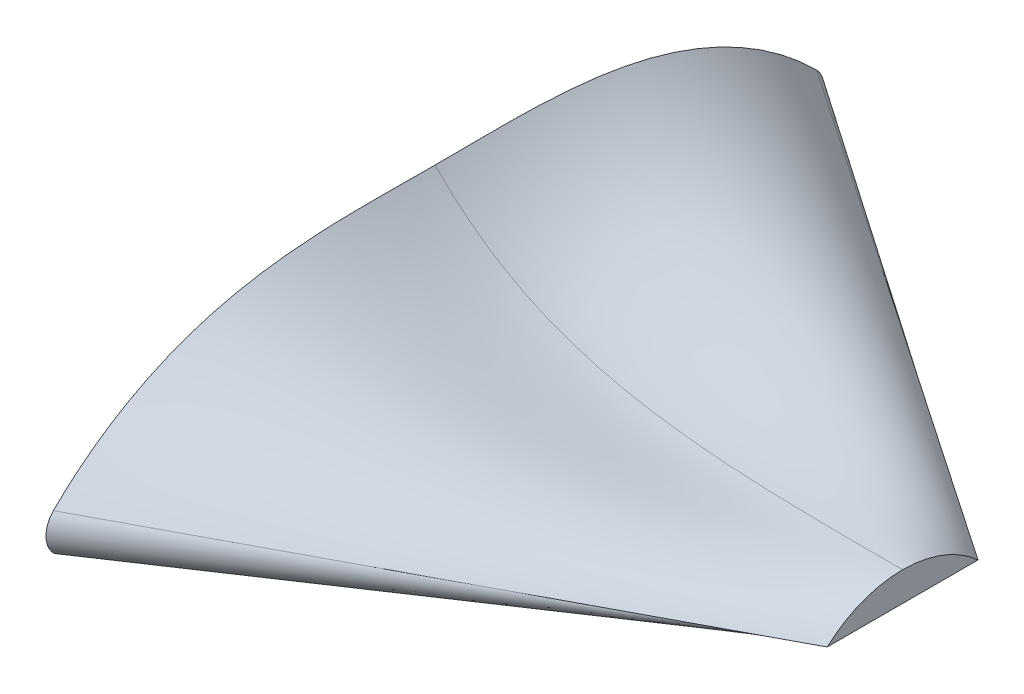
ISO-10303-21;
HEADER;
FILE_DESCRIPTION(('STEP AP214'),'2;1');
FILE_NAME('part.step','',(''),(''),'','','');
FILE_SCHEMA(('AUTOMOTIVE_DESIGN { 1 0 10303 214 1 1 1 1 }'));
ENDSEC;
DATA;
#1=APPLICATION_CONTEXT('core data for automotive mechanical design processes');
#2=APPLICATION_PROTOCOL_DEFINITION('international standard','automotive_design',2000,#1);
#3=PRODUCT_CONTEXT('',#1,'mechanical');
#4=PRODUCT('Part','Part','',(#3));
#5=PRODUCT_RELATED_PRODUCT_CATEGORY('part','',(#4));
#6=PRODUCT_DEFINITION_FORMATION('','',#4);
#7=PRODUCT_DEFINITION_CONTEXT('part definition',#1,'design');
#8=PRODUCT_DEFINITION('design','',#6,#7);
#9=PRODUCT_DEFINITION_SHAPE('','',#8);
#10=(LENGTH_UNIT() NAMED_UNIT(*) SI_UNIT(.MILLI.,.METRE.));
#11=(NAMED_UNIT(*) PLANE_ANGLE_UNIT() SI_UNIT($,.RADIAN.));
#12=(NAMED_UNIT(*) SI_UNIT($,.STERADIAN.) SOLID_ANGLE_UNIT());
#13=UNCERTAINTY_MEASURE_WITH_UNIT(LENGTH_MEASURE(1.E-05),#10,'distance_accuracy_value','');
#14=(GEOMETRIC_REPRESENTATION_CONTEXT(3) GLOBAL_UNCERTAINTY_ASSIGNED_CONTEXT((#13)) GLOBAL_UNIT_ASSIGNED_CONTEXT((#10,
#11,#12)) REPRESENTATION_CONTEXT('',''));
#15=CARTESIAN_POINT('',(0.,0.,0.));
#16=DIRECTION('',(0.,0.,1.));
#17=DIRECTION('',(1.,0.,0.));
#18=AXIS2_PLACEMENT_3D('',#15,#16,#17);
#19=CARTESIAN_POINT('',(5.,0.,0.));
#20=DIRECTION('',(-1.,0.,0.));
#21=DIRECTION('',(0.,0.,1.));
#22=AXIS2_PLACEMENT_3D('',#19,#20,#21);
#23=PLANE('',#22);
#24=CARTESIAN_POINT('',(5.,4.99999999999999,-39.9999631911383));
#25=DIRECTION('',(-1.,0.,0.));
#26=DIRECTION('',(0.,0.,1.));
#27=AXIS2_PLACEMENT_3D('',#24,#25,#26);
#28=CIRCLE('',#27,4.00000000000001);
#29=CARTESIAN_POINT('',(5.,4.99999999999999,-35.9999631911383));
#30=VERTEX_POINT('',#29);
#31=EDGE_CURVE('E304',#30,#30,#28,.T.);
#32=ORIENTED_EDGE('',*,*,#31,.F.);
#33=EDGE_LOOP('',(#32));
#34=FACE_BOUND('',#33,.T.);
#35=CARTESIAN_POINT('',(5.,3.59999999999999,-76.7254190205042));
#36=CARTESIAN_POINT('',(5.,3.93743228357616,-76.3874018561561));
#37=CARTESIAN_POINT('',(5.,4.26765023761743,-76.0421847193579));
#38=CARTESIAN_POINT('',(5.,4.91305336804679,-75.3380492013204));
#39=CARTESIAN_POINT('',(5.,5.22824034681512,-74.9791324721533));
#40=CARTESIAN_POINT('',(5.,5.84303741353757,-74.2482403196132));
#41=CARTESIAN_POINT('',(5.,6.14264858405348,-73.8762658068108));
#42=CARTESIAN_POINT('',(5.,6.7257829860108,-73.1199272854748));
#43=CARTESIAN_POINT('',(5.,7.00930660717979,-72.7355635774285));
#44=CARTESIAN_POINT('',(5.,7.55501458514436,-71.9619058359314));
#45=CARTESIAN_POINT('',(5.,7.81748343604167,-71.5728124190995));
#46=CARTESIAN_POINT('',(5.,8.32599247402661,-70.7840431241096));
#47=CARTESIAN_POINT('',(5.,8.57203291478204,-70.384367409484));
#48=CARTESIAN_POINT('',(5.,9.0473155388448,-69.575165888886));
#49=CARTESIAN_POINT('',(5.,9.27655818285029,-69.1656403534653));
#50=CARTESIAN_POINT('',(5.,9.7179358459217,-68.3375077942191));
#51=CARTESIAN_POINT('',(5.,9.93007196262451,-67.9189013552585));
#52=CARTESIAN_POINT('',(5.,10.3373422104496,-67.0728350064427));
#53=CARTESIAN_POINT('',(5.,10.5324540206845,-66.6453643565745));
#54=CARTESIAN_POINT('',(5.,10.9052984125998,-65.7829008197929));
#55=CARTESIAN_POINT('',(5.,11.0830305296047,-65.3479077321202));
#56=CARTESIAN_POINT('',(5.,11.4211557563464,-64.4712051567223));
#57=CARTESIAN_POINT('',(5.,11.5815476779937,-64.0294952111435));
#58=CARTESIAN_POINT('',(5.,11.8851368938041,-63.1402056710114));
#59=CARTESIAN_POINT('',(5.,12.0283339677281,-62.6926260013574));
#60=CARTESIAN_POINT('',(5.,12.2990221749549,-61.7883957563251));
#61=CARTESIAN_POINT('',(5.,12.4263617772562,-61.331699878374));
#62=CARTESIAN_POINT('',(5.,12.6642653606371,-60.4139905299096));
#63=CARTESIAN_POINT('',(5.,12.7748300989486,-59.9529772552854));
#64=CARTESIAN_POINT('',(5.,12.979772806041,-59.027431837586));
#65=CARTESIAN_POINT('',(5.,13.0741526428364,-58.5629001070715));
#66=CARTESIAN_POINT('',(5.,13.2475078904096,-57.6311638525804));
#67=CARTESIAN_POINT('',(5.,13.3264890258607,-57.1639603886011));
#68=CARTESIAN_POINT('',(5.,13.4834911977533,-56.1395599554604));
#69=CARTESIAN_POINT('',(5.,13.5585569415281,-55.5819104072356));
#70=CARTESIAN_POINT('',(5.,13.6902095100587,-54.4644382967973));
#71=CARTESIAN_POINT('',(5.,13.7467955399675,-53.9046156421621));
#72=CARTESIAN_POINT('',(5.,13.8436291600977,-52.7832396184939));
#73=CARTESIAN_POINT('',(5.,13.8838668706888,-52.2216854089481));
#74=CARTESIAN_POINT('',(5.,13.9503294054591,-51.0973089222936));
#75=CARTESIAN_POINT('',(5.,13.9765427549874,-50.5344859840233));
#76=CARTESIAN_POINT('',(5.,14.017455103225,-49.4080448908364));
#77=CARTESIAN_POINT('',(5.,14.0321460205014,-48.8444264550463));
#78=CARTESIAN_POINT('',(5.,14.052549816619,-47.7275563872463));
#79=CARTESIAN_POINT('',(5.,14.0584250202647,-47.1743074462124));
#80=CARTESIAN_POINT('',(5.,14.0643881773846,-46.0679660488893));
#81=CARTESIAN_POINT('',(5.,14.0644779979006,-45.514873599719));
#82=CARTESIAN_POINT('',(5.,14.0615319358146,-44.4092862800449));
#83=CARTESIAN_POINT('',(5.,14.0584993546539,-43.856791395417));
#84=CARTESIAN_POINT('',(5.,14.0518660343467,-42.7528399211496));
#85=CARTESIAN_POINT('',(5.,14.048266369452,-42.2013833240343));
#86=CARTESIAN_POINT('',(5.,14.0441755921167,-41.3749374732235));
#87=CARTESIAN_POINT('',(5.,14.0430307910705,-41.0999519509151));
#88=CARTESIAN_POINT('',(5.,14.0414238818554,-40.549977837875));
#89=CARTESIAN_POINT('',(5.00000000000001,14.0409617766091,-40.2749892471352));
#90=CARTESIAN_POINT('',(5.00000000000003,14.0409660441617,-40.));
#91=B_SPLINE_CURVE_WITH_KNOTS('',3,(#35,#36,#37,#38,#39,#40,#41,#42,#43,#44,#45,#46,#47,#48,#49,
#50,#51,#52,#53,#54,#55,#56,#57,#58,#59,#60,#61,#62,#63,#64,#65,#66,#67,#68,#69,#70,#71,#72,#73,
#74,#75,#76,#77,#78,#79,#80,#81,#82,#83,#84,#85,#86,#87,#88,#89,#90),.UNSPECIFIED.,.F.,.F.,(4,2,
2,2,2,2,2,2,2,2,2,2,2,2,2,2,2,2,2,2,2,2,2,2,2,2,2,4),(0.,1.43273489925903,2.86529756353206,
4.29776052725402,5.73018877413619,7.13781356403322,8.54541661404931,9.95298104453301,
11.3604550869443,12.769747602725,14.179077788027,15.5885044745873,16.9979492117726,
18.4199693092654,19.8419251964366,21.2637168549556,22.6849789312863,24.3726622680029,
26.0604181855732,27.749192537579,29.4393465300067,31.130684880218,32.7904809299915,
34.449741332609,36.1072491321412,37.761653983198,38.586616898807,39.411583345995),.UNSPECIFIED.);
#92=CARTESIAN_POINT('',(5.,3.59999999999999,-76.7254190205042));
#93=VERTEX_POINT('',#92);
#94=CARTESIAN_POINT('',(4.99999999856672,14.0409660471408,-40.));
#95=VERTEX_POINT('',#94);
#96=EDGE_CURVE('E190',#93,#95,#91,.T.);
#97=ORIENTED_EDGE('',*,*,#96,.F.);
#98=CARTESIAN_POINT('',(5.,0.,-76.659471836822));
#99=CARTESIAN_POINT('',(5.,0.0511488168467018,-76.7118126949849));
#100=CARTESIAN_POINT('',(5.,0.10452466581077,-76.7619709941109));
#101=CARTESIAN_POINT('',(5.,0.215314804936702,-76.8576199049824));
#102=CARTESIAN_POINT('',(5.,0.272729423525625,-76.9031101363859));
#103=CARTESIAN_POINT('',(5.,0.391146477501311,-76.9890924523508));
#104=CARTESIAN_POINT('',(5.,0.452147293723972,-77.0295867673589));
#105=CARTESIAN_POINT('',(5.,0.577341762314448,-77.1052971840566));
#106=CARTESIAN_POINT('',(5.,0.641535361954586,-77.1405133728741));
#107=CARTESIAN_POINT('',(5.,0.772666053999531,-77.2053169724821));
#108=CARTESIAN_POINT('',(5.,0.839601750755324,-77.2349072045036));
#109=CARTESIAN_POINT('',(5.,0.97575401334259,-77.2882236835449));
#110=CARTESIAN_POINT('',(5.,1.04497016593395,-77.3119509864309));
#111=CARTESIAN_POINT('',(5.,1.185115336312,-77.3534309711804));
#112=CARTESIAN_POINT('',(5.,1.25604309645116,-77.3711879047799));
#113=CARTESIAN_POINT('',(5.,1.39921583880213,-77.4006343950045));
#114=CARTESIAN_POINT('',(5.,1.47146200068962,-77.4123182111698));
#115=CARTESIAN_POINT('',(5.,1.61581215271314,-77.4293634913821));
#116=CARTESIAN_POINT('',(5.,1.68790713297469,-77.4348003165059));
#117=CARTESIAN_POINT('',(5.,1.83230335185098,-77.4394669144797));
#118=CARTESIAN_POINT('',(5.,1.90460466685098,-77.4386939730176));
#119=CARTESIAN_POINT('',(5.,2.12099597497724,-77.4271026830581));
#120=CARTESIAN_POINT('',(5.,2.26474244761141,-77.4070316597572));
#121=CARTESIAN_POINT('',(5.,2.4753066605448,-77.359115334133));
#122=CARTESIAN_POINT('',(5.,2.5443356053733,-77.3403059657367));
#123=CARTESIAN_POINT('',(5.,2.68048132502429,-77.2968954955494));
#124=CARTESIAN_POINT('',(5.,2.74759985544425,-77.2722999172473));
#125=CARTESIAN_POINT('',(5.,2.94535098790418,-77.1899719720296));
#126=CARTESIAN_POINT('',(5.,3.07255353093709,-77.1236588626164));
#127=CARTESIAN_POINT('',(5.,3.26633227779034,-77.0007179054517));
#128=CARTESIAN_POINT('',(5.,3.33710273869416,-76.9505101938476));
#129=CARTESIAN_POINT('',(5.,3.47295335784409,-76.84310361131));
#130=CARTESIAN_POINT('',(5.,3.53804165900599,-76.7859150361764));
#131=CARTESIAN_POINT('',(5.,3.59999999999999,-76.7254190205042));
#132=B_SPLINE_CURVE_WITH_KNOTS('',3,(#98,#99,#100,#101,#102,#103,#104,#105,#106,#107,#108,#109,
#110,#111,#112,#113,#114,#115,#116,#117,#118,#119,#120,#121,#122,#123,#124,#125,#126,#127,#128,
#129,#130,#131),.UNSPECIFIED.,.F.,.F.,(4,2,2,2,2,2,2,2,2,2,2,2,2,2,2,2,4),(0.,0.219477114664113,
0.438972097576259,0.658368728712478,0.877761737794023,1.09704443667954,1.31628761568893,
1.53537433062462,1.7546677568382,1.97128698737865,2.18800090814341,2.62092424760503,
2.8353554661266,3.04958281430292,3.47750799326977,3.73741546458134,3.99694413791897),.UNSPECIFIED.);
#133=CARTESIAN_POINT('',(5.,0.,-76.659471836822));
#134=VERTEX_POINT('',#133);
#135=EDGE_CURVE('E197',#134,#93,#132,.T.);
#136=ORIENTED_EDGE('',*,*,#135,.F.);
#137=DIRECTION('',(0.,0.,-1.));
#138=VECTOR('',#137,1.);
#139=CARTESIAN_POINT('',(5.,0.,0.));
#140=LINE('',#139,#138);
#141=CARTESIAN_POINT('',(5.,0.,-3.34045454545455));
#142=VERTEX_POINT('',#141);
#143=EDGE_CURVE('E279',#142,#134,#140,.T.);
#144=ORIENTED_EDGE('',*,*,#143,.F.);
#145=CARTESIAN_POINT('',(5.,3.6,-3.2745));
#146=CARTESIAN_POINT('',(5.,3.51749186203193,-3.1939012074687));
#147=CARTESIAN_POINT('',(5.,3.42928684829486,-3.11911367760644));
#148=CARTESIAN_POINT('',(5.,3.24341173908781,-2.9823289359893));
#149=CARTESIAN_POINT('',(5.,3.14573855731913,-2.92033591555066));
#150=CARTESIAN_POINT('',(5.,2.98252051916328,-2.83183808090266));
#151=CARTESIAN_POINT('',(5.,2.91932653754998,-2.80092926685083));
#152=CARTESIAN_POINT('',(5.,2.79054927996777,-2.74457067225097));
#153=CARTESIAN_POINT('',(5.,2.72496581345368,-2.71912132817809));
#154=CARTESIAN_POINT('',(5.,2.5253418491453,-2.6512001910213));
#155=CARTESIAN_POINT('',(5.,2.38834860088624,-2.61711250048871));
#156=CARTESIAN_POINT('',(5.,2.1100167076104,-2.57180403676965));
#157=CARTESIAN_POINT('',(5.,1.96865979692565,-2.56069816595792));
#158=CARTESIAN_POINT('',(5.,1.68599629544457,-2.56232668360057));
#159=CARTESIAN_POINT('',(5.,1.5446897038734,-2.57506068753158));
#160=CARTESIAN_POINT('',(5.,1.33508993046166,-2.61147414129443));
#161=CARTESIAN_POINT('',(5.,1.26520169558626,-2.62664263348465));
#162=CARTESIAN_POINT('',(5.,1.12690542280786,-2.662722845137));
#163=CARTESIAN_POINT('',(5.,1.05849734316841,-2.68363440243172));
#164=CARTESIAN_POINT('',(5.,0.923657181644717,-2.73109941523135));
#165=CARTESIAN_POINT('',(5.,0.857225314519525,-2.75765348138443));
#166=CARTESIAN_POINT('',(5.,0.726848735943094,-2.81623905497365));
#167=CARTESIAN_POINT('',(5.,0.662903878534444,-2.8482702403719));
#168=CARTESIAN_POINT('',(5.,0.489924831171504,-2.94407802836477));
#169=CARTESIAN_POINT('',(5.,0.383864468657998,-3.01337967707288));
#170=CARTESIAN_POINT('',(5.,0.23324220274403,-3.12815484096427));
#171=CARTESIAN_POINT('',(5.,0.184443511471317,-3.16821971400462));
#172=CARTESIAN_POINT('',(5.,0.0898862280673335,-3.25179465643971));
#173=CARTESIAN_POINT('',(5.,0.0441278272990227,-3.29530494231967));
#174=CARTESIAN_POINT('',(5.,0.,-3.34045454545454));
#175=B_SPLINE_CURVE_WITH_KNOTS('',3,(#145,#146,#147,#148,#149,#150,#151,#152,#153,#154,#155,
#156,#157,#158,#159,#160,#161,#162,#163,#164,#165,#166,#167,#168,#169,#170,#171,#172,#173,#174),
.UNSPECIFIED.,.F.,.F.,(4,2,2,2,2,2,2,2,2,2,2,2,2,2,4),(0.,0.345797022912793,0.69170714529531,
0.902517605346588,1.11334491305228,1.53473295791806,1.95822277893635,2.38170576936788,
2.59605383287214,2.81039584443476,3.02476106451672,3.23911368490883,3.6176288967695,
3.80690900639607,3.99620101848904),.UNSPECIFIED.);
#176=CARTESIAN_POINT('',(5.,3.6,-3.2745));
#177=VERTEX_POINT('',#176);
#178=EDGE_CURVE('E160',#177,#142,#175,.T.);
#179=ORIENTED_EDGE('',*,*,#178,.F.);
#180=CARTESIAN_POINT('',(4.99999999856672,14.0409660471408,-40.));
#181=CARTESIAN_POINT('',(4.99999999948511,14.0409441539015,-39.5758257928182));
#182=CARTESIAN_POINT('',(4.99999999986199,14.0420593836273,-39.1516551944734));
#183=CARTESIAN_POINT('',(5.00000000013811,14.0455829547407,-38.3030214777094));
#184=CARTESIAN_POINT('',(5.00000000003701,14.0479922021839,-37.8785583627024));
#185=CARTESIAN_POINT('',(4.99999999996297,14.0531212087982,-37.029426145117));
#186=CARTESIAN_POINT('',(4.99999999999008,14.0558411199163,-36.6047570437742));
#187=CARTESIAN_POINT('',(5.00000000000993,14.0604782807002,-35.755296130507));
#188=CARTESIAN_POINT('',(5.00000000000266,14.0623953080717,-35.3305043171412));
#189=CARTESIAN_POINT('',(4.99999999999734,14.0642596077262,-34.4808815271381));
#190=CARTESIAN_POINT('',(4.99999999999928,14.0642067266955,-34.056050550026));
#191=CARTESIAN_POINT('',(5.00000000000073,14.0608994378944,-33.1989375948005));
#192=CARTESIAN_POINT('',(5.0000000000002,14.0575888263589,-32.7666557782155));
#193=CARTESIAN_POINT('',(4.9999999999998,14.0464082703539,-31.9022260994095));
#194=CARTESIAN_POINT('',(4.99999999999995,14.0385391645738,-31.4700782271743));
#195=CARTESIAN_POINT('',(5.00000000000005,14.0169784825218,-30.6060059129998));
#196=CARTESIAN_POINT('',(5.00000000000001,14.0032880322319,-30.1740814440167));
#197=CARTESIAN_POINT('',(4.99999999999999,13.9688684465812,-29.3105433150413));
#198=CARTESIAN_POINT('',(5.,13.9481399200274,-28.8789296314005));
#199=CARTESIAN_POINT('',(5.,13.8985045821,-28.0161022452724));
#200=CARTESIAN_POINT('',(5.,13.8695965222287,-27.5848886139364));
#201=CARTESIAN_POINT('',(5.,13.7937219468961,-26.6101297731266));
#202=CARTESIAN_POINT('',(5.,13.7440074795407,-26.0667931965869));
#203=CARTESIAN_POINT('',(5.,13.6278152939436,-24.9818039962027));
#204=CARTESIAN_POINT('',(5.,13.5613347266627,-24.4401516744132));
#205=CARTESIAN_POINT('',(5.,13.409845123432,-23.3594525199217));
#206=CARTESIAN_POINT('',(5.,13.3248370623947,-22.8204055516516));
#207=CARTESIAN_POINT('',(5.,13.1347600759931,-21.7458097085166));
#208=CARTESIAN_POINT('',(5.,13.0296900552281,-21.2102610263133));
#209=CARTESIAN_POINT('',(5.,12.799409222632,-20.1492347711758));
#210=CARTESIAN_POINT('',(5.,12.6744156108137,-19.623710224059));
#211=CARTESIAN_POINT('',(5.,12.4026239950708,-18.5782456156235));
#212=CARTESIAN_POINT('',(5.,12.2558233168376,-18.0583062476408));
#213=CARTESIAN_POINT('',(5.,11.9398048616604,-17.0252988560667));
#214=CARTESIAN_POINT('',(5.,11.7705880358376,-16.5122305419515));
#215=CARTESIAN_POINT('',(5.,11.4093378086784,-15.4941728659362));
#216=CARTESIAN_POINT('',(5.,11.2173044821212,-14.989183477564));
#217=CARTESIAN_POINT('',(5.,10.8460713043083,-14.0765713661721));
#218=CARTESIAN_POINT('',(5.,10.6705554623278,-13.6674462619844));
#219=CARTESIAN_POINT('',(5.,10.303913668885,-12.8561855396402));
#220=CARTESIAN_POINT('',(5.,10.1127859126404,-12.4540507361181));
#221=CARTESIAN_POINT('',(5.,9.71502542780087,-11.6575038847497));
#222=CARTESIAN_POINT('',(5.,9.50839211967086,-11.263092126255));
#223=CARTESIAN_POINT('',(5.,9.07980994627717,-10.4826720012449));
#224=CARTESIAN_POINT('',(5.,8.85786092307269,-10.0966637214429));
#225=CARTESIAN_POINT('',(5.,8.39892595577074,-9.33368693090498));
#226=CARTESIAN_POINT('',(5.,8.1619398653725,-8.95671850817015));
#227=CARTESIAN_POINT('',(5.,7.66681183255086,-8.20262556393348));
#228=CARTESIAN_POINT('',(5.,7.40827682217232,-7.82575902203173));
#229=CARTESIAN_POINT('',(5.,6.87609606969416,-7.0828263144194));
#230=CARTESIAN_POINT('',(5.,6.60244967462634,-6.71676061646734));
#231=CARTESIAN_POINT('',(5.,6.04045642267068,-5.99601734069202));
#232=CARTESIAN_POINT('',(5.,5.75210769555495,-5.64134122109332));
#233=CARTESIAN_POINT('',(5.,5.16114317106239,-4.94394712378118));
#234=CARTESIAN_POINT('',(5.,4.85852425825254,-4.6012317860012));
#235=CARTESIAN_POINT('',(5.,4.23947695732176,-3.92830884864478));
#236=CARTESIAN_POINT('',(4.99999999999998,3.92304423479402,-3.5981052365122));
#237=CARTESIAN_POINT('',(4.99999999999996,3.60000000000001,-3.27449999999997));
#238=B_SPLINE_CURVE_WITH_KNOTS('',3,(#180,#181,#182,#183,#184,#185,#186,#187,#188,#189,#190,
#191,#192,#193,#194,#195,#196,#197,#198,#199,#200,#201,#202,#203,#204,#205,#206,#207,#208,#209,
#210,#211,#212,#213,#214,#215,#216,#217,#218,#219,#220,#221,#222,#223,#224,#225,#226,#227,#228,
#229,#230,#231,#232,#233,#234,#235,#236,#237),.UNSPECIFIED.,.F.,.F.,(4,2,2,2,2,2,2,2,2,2,2,2,2,
2,2,2,2,2,2,2,2,2,2,2,2,2,2,2,4),(0.,1.27251617283478,2.54592450997283,3.81995836539354,
5.09434472962129,6.36883027666969,7.66569629239758,8.96232378143317,10.2587005868843,
11.5549652818272,12.8514279412633,14.4880113948628,16.1248731383354,17.7616487712977,
19.3985137992198,21.0186216671867,22.6389283812679,24.2591663674388,25.8793990435633,
27.2146401669907,28.5500358671852,29.8854815039684,31.2209409143752,32.5564133199181,
33.9270994781211,35.2978449105675,36.6687651474862,38.0399860787829,39.4116403995615),.UNSPECIFIED.);
#239=EDGE_CURVE('E13',#95,#177,#238,.T.);
#240=ORIENTED_EDGE('',*,*,#239,.F.);
#241=EDGE_LOOP('',(#97,#136,#144,#179,#240));
#242=FACE_BOUND('',#241,.T.);
#243=ADVANCED_FACE('F141',(#34,#242),#23,.T.);
#244=CARTESIAN_POINT('',(0.,3.99999999999999,-80.));
#245=CARTESIAN_POINT('',(16.6666666666667,2.66666666666666,-69.0847300683473));
#246=CARTESIAN_POINT('',(33.3333333333333,1.33333333333333,-58.1694601366945));
#247=CARTESIAN_POINT('',(50.,0.,-47.2541902050417));
#248=CARTESIAN_POINT('',(0.,6.63904405261519,-77.3609559473848));
#249=CARTESIAN_POINT('',(16.6666666666667,4.57394141092913,-67.1632839463743));
#250=CARTESIAN_POINT('',(33.3333333333333,2.50883876924307,-56.9656119453637));
#251=CARTESIAN_POINT('',(50.,0.443736127557011,-46.7679399443531));
#252=CARTESIAN_POINT('',(0.,11.3720944633804,-71.5812116978277));
#253=CARTESIAN_POINT('',(15.950170355026,6.51788597364558,-62.9574696470849));
#254=CARTESIAN_POINT('',(32.629103556807,3.88093649349558,-54.3337275963421));
#255=CARTESIAN_POINT('',(50.,1.245103807066,-45.7099855455994));
#256=CARTESIAN_POINT('',(0.,16.6162347407487,-61.7420127961851));
#257=CARTESIAN_POINT('',(13.8006814201041,5.87642750944805,-55.8014690698099));
#258=CARTESIAN_POINT('',(30.5164142272278,4.00565631648663,-49.8609253434348));
#259=CARTESIAN_POINT('',(50.,2.13935229840692,-43.9203816170601));
#260=CARTESIAN_POINT('',(0.,19.8401866065488,-51.0920119199332));
#261=CARTESIAN_POINT('',(11.6511924851822,3.7734502946322,-48.058931934915));
#262=CARTESIAN_POINT('',(28.4037248976486,3.22752704980928,-45.0258519498969));
#263=CARTESIAN_POINT('',(50.,2.68942136102937,-41.9927719648795));
#264=CARTESIAN_POINT('',(0.,20.5685424949238,-43.7023061077576));
#265=CARTESIAN_POINT('',(10.9346961735416,2.8215150380922,-42.6893373185495));
#266=CARTESIAN_POINT('',(27.6994951211223,2.81257236123952,-41.6763685293058));
#267=CARTESIAN_POINT('',(50.,2.8125767374507,-40.6633997403421));
#268=CARTESIAN_POINT('',(0.,20.5685424949238,-40.));
#269=CARTESIAN_POINT('',(10.9346961735416,2.82153606086535,-40.));
#270=CARTESIAN_POINT('',(27.6994951211223,2.81260170348539,-40.));
#271=CARTESIAN_POINT('',(50.,2.81260169586887,-40.0000000000008));
#272=B_SPLINE_SURFACE_WITH_KNOTS('',3,3,((#244,#245,#246,#247),(#248,#249,#250,#251),(#252,#253,
#254,#255),(#256,#257,#258,#259),(#260,#261,#262,#263),(#264,#265,#266,#267),(#268,#269,#270,
#271)),.UNSPECIFIED.,.F.,.F.,.F.,(4,1,1,1,4),(4,4),(0.744223091094177,0.808167318320632,
0.872111545547088,0.936055772773544,1.),(0.,1.),.UNSPECIFIED.);
#273=CARTESIAN_POINT('',(0.,3.99999999999999,-80.));
#274=CARTESIAN_POINT('',(16.6666666666667,2.66666666666666,-69.0847300683473));
#275=CARTESIAN_POINT('',(33.3333333333333,1.33333333333333,-58.1694601366945));
#276=CARTESIAN_POINT('',(50.,0.,-47.2541902050417));
#277=B_SPLINE_CURVE_WITH_KNOTS('',3,(#273,#274,#275,#276),.UNSPECIFIED.,.F.,.F.,(4,4),(0.,1.),.UNSPECIFIED.);
#278=CARTESIAN_POINT('',(50.,0.,-47.2541902050417));
#279=VERTEX_POINT('',#278);
#280=EDGE_CURVE('E146',#93,#279,#277,.T.);
#281=CARTESIAN_POINT('',(0.,20.5685424949238,-40.));
#282=CARTESIAN_POINT('',(10.9346961735416,2.82153606086535,-40.));
#283=CARTESIAN_POINT('',(27.6994951211223,2.81260170348539,-40.));
#284=CARTESIAN_POINT('',(50.,2.81260169586887,-40.0000000000008));
#285=B_SPLINE_CURVE_WITH_KNOTS('',3,(#281,#282,#283,#284),.UNSPECIFIED.,.F.,.F.,(4,4),(0.,1.),.UNSPECIFIED.);
#286=CARTESIAN_POINT('',(50.,2.81260169586887,-40.0000000000008));
#287=VERTEX_POINT('',#286);
#288=EDGE_CURVE('E167',#95,#287,#285,.T.);
#289=CARTESIAN_POINT('',(50.,-7.94965417671036,-39.9995951025209));
#290=DIRECTION('',(1.,0.,0.));
#291=DIRECTION('',(0.,0.,-1.));
#292=AXIS2_PLACEMENT_3D('',#289,#290,#291);
#293=CIRCLE('',#292,10.7622558801957);
#294=EDGE_CURVE('E205',#279,#287,#293,.T.);
#295=ORIENTED_EDGE('',*,*,#280,.F.);
#296=ORIENTED_EDGE('',*,*,#96,.T.);
#297=ORIENTED_EDGE('',*,*,#288,.T.);
#298=ORIENTED_EDGE('',*,*,#294,.F.);
#299=EDGE_LOOP('',(#295,#296,#297,#298));
#300=FACE_BOUND('',#299,.T.);
#301=ADVANCED_FACE('F195',(#300),#272,.T.);
#302=CARTESIAN_POINT('',(0.,0.,-80.));
#303=CARTESIAN_POINT('',(16.6666666666667,0.,-68.8649061227399));
#304=CARTESIAN_POINT('',(33.3333333333333,0.,-57.7298122454798));
#305=CARTESIAN_POINT('',(50.,0.,-46.5947183682197));
#306=CARTESIAN_POINT('',(0.,0.261799386095722,-80.2617993860957));
#307=CARTESIAN_POINT('',(16.6666666666667,0.174532924063815,-69.0577577089377));
#308=CARTESIAN_POINT('',(33.3333333333333,0.0872664620319073,-57.8537160317796));
#309=CARTESIAN_POINT('',(50.,0.,-46.6496743546216));
#310=CARTESIAN_POINT('',(0.,0.889345576944907,-80.681300868557));
#311=CARTESIAN_POINT('',(16.6666666666667,0.592897051296605,-69.3740626881798));
#312=CARTESIAN_POINT('',(33.3333333333334,0.296448525648302,-58.0668245078025));
#313=CARTESIAN_POINT('',(50.0000000000001,0.,-46.7595863274253));
#314=CARTESIAN_POINT('',(0.,2.,-80.9021203978851));
#315=CARTESIAN_POINT('',(16.6666666666667,1.33333333333334,-69.5762316941336));
#316=CARTESIAN_POINT('',(33.3333333333333,0.666666666666668,-58.2503429903822));
#317=CARTESIAN_POINT('',(50.,0.,-46.9244542866307));
#318=CARTESIAN_POINT('',(0.,3.1106544230551,-80.6813008685571));
#319=CARTESIAN_POINT('',(16.6666666666667,2.07376961537007,-69.4839746609834));
#320=CARTESIAN_POINT('',(33.3333333333334,1.03688480768503,-58.2866484534099));
#321=CARTESIAN_POINT('',(50.0000000000001,0.,-47.0893222458363));
#322=CARTESIAN_POINT('',(0.,3.73820061390428,-80.2617993860957));
#323=CARTESIAN_POINT('',(16.6666666666667,2.49213374260285,-69.2409443302771));
#324=CARTESIAN_POINT('',(33.3333333333333,1.24606687130143,-58.2200892744585));
#325=CARTESIAN_POINT('',(50.,0.,-47.1992342186399));
#326=CARTESIAN_POINT('',(0.,3.99999999999999,-80.));
#327=CARTESIAN_POINT('',(16.6666666666667,2.66666666666666,-69.0847300683473));
#328=CARTESIAN_POINT('',(33.3333333333333,1.33333333333333,-58.1694601366945));
#329=CARTESIAN_POINT('',(50.,0.,-47.2541902050417));
#330=B_SPLINE_SURFACE_WITH_KNOTS('',3,3,((#302,#303,#304,#305),(#306,#307,#308,#309),(#310,#311,
#312,#313),(#314,#315,#316,#317),(#318,#319,#320,#321),(#322,#323,#324,#325),(#326,#327,#328,
#329)),.UNSPECIFIED.,.F.,.F.,.F.,(4,1,1,1,4),(4,4),(0.72088961147396,0.726722981379014,
0.732556351284068,0.738389721189122,0.744223091094177),(0.,1.),.UNSPECIFIED.);
#331=CARTESIAN_POINT('',(0.,0.,-80.));
#332=CARTESIAN_POINT('',(16.6666666666667,0.,-68.8649061227399));
#333=CARTESIAN_POINT('',(33.3333333333333,0.,-57.7298122454798));
#334=CARTESIAN_POINT('',(50.,0.,-46.5947183682197));
#335=B_SPLINE_CURVE_WITH_KNOTS('',3,(#331,#332,#333,#334),.UNSPECIFIED.,.F.,.F.,(4,4),(0.,1.),.UNSPECIFIED.);
#336=CARTESIAN_POINT('',(50.,0.,-46.5947183682197));
#337=VERTEX_POINT('',#336);
#338=EDGE_CURVE('E207',#134,#337,#335,.T.);
#339=DIRECTION('',(0.,0.,-1.));
#340=VECTOR('',#339,1.);
#341=CARTESIAN_POINT('',(50.,0.,-32.745));
#342=LINE('',#341,#340);
#343=EDGE_CURVE('E241',#337,#279,#342,.T.);
#344=ORIENTED_EDGE('',*,*,#338,.F.);
#345=ORIENTED_EDGE('',*,*,#135,.T.);
#346=ORIENTED_EDGE('',*,*,#280,.T.);
#347=ORIENTED_EDGE('',*,*,#343,.F.);
#348=EDGE_LOOP('',(#344,#345,#346,#347));
#349=FACE_BOUND('',#348,.T.);
#350=ADVANCED_FACE('F248',(#349),#330,.T.);
#351=CARTESIAN_POINT('',(0.,0.,0.));
#352=DIRECTION('',(0.,-1.,0.));
#353=DIRECTION('',(0.,0.,-1.));
#354=AXIS2_PLACEMENT_3D('',#351,#352,#353);
#355=PLANE('',#354);
#356=CARTESIAN_POINT('',(0.,0.,0.));
#357=CARTESIAN_POINT('',(16.6666666666667,0.,-11.1348484848485));
#358=CARTESIAN_POINT('',(33.3333333333333,0.,-22.269696969697));
#359=CARTESIAN_POINT('',(50.,0.,-33.4045454545455));
#360=B_SPLINE_CURVE_WITH_KNOTS('',3,(#356,#357,#358,#359),.UNSPECIFIED.,.F.,.F.,(4,4),(0.,1.),.UNSPECIFIED.);
#361=CARTESIAN_POINT('',(50.,0.,-33.4045454545455));
#362=VERTEX_POINT('',#361);
#363=EDGE_CURVE('E387',#142,#362,#360,.T.);
#364=ORIENTED_EDGE('',*,*,#363,.F.);
#365=ORIENTED_EDGE('',*,*,#143,.T.);
#366=ORIENTED_EDGE('',*,*,#338,.T.);
#367=EDGE_CURVE('E381',#362,#337,#342,.T.);
#368=ORIENTED_EDGE('',*,*,#367,.F.);
#369=EDGE_LOOP('',(#364,#365,#366,#368));
#370=FACE_BOUND('',#369,.T.);
#371=ADVANCED_FACE('F143',(#370),#355,.T.);
#372=CARTESIAN_POINT('',(0.,4.,0.));
#373=CARTESIAN_POINT('',(16.6666666666667,2.66666666666667,-10.915));
#374=CARTESIAN_POINT('',(33.3333333333333,1.33333333333333,-21.83));
#375=CARTESIAN_POINT('',(50.,0.,-32.745));
#376=CARTESIAN_POINT('',(0.,3.73820061390428,0.261799386095719));
#377=CARTESIAN_POINT('',(16.6666666666667,2.49213374260285,-10.7587877830069));
#378=CARTESIAN_POINT('',(33.3333333333333,1.24606687130143,-21.7793749521095));
#379=CARTESIAN_POINT('',(50.,0.,-32.7999621212121));
#380=CARTESIAN_POINT('',(0.,3.11065442305509,0.681300868557217));
#381=CARTESIAN_POINT('',(16.6666666666667,2.07376961537006,-10.515761542174));
#382=CARTESIAN_POINT('',(33.3333333333333,1.03688480768503,-21.7128239529052));
#383=CARTESIAN_POINT('',(50.,0.,-32.9098863636364));
#384=CARTESIAN_POINT('',(0.,2.00000000000001,0.902120397884772));
#385=CARTESIAN_POINT('',(16.6666666666667,1.33333333333334,-10.4235106438344));
#386=CARTESIAN_POINT('',(33.3333333333334,0.666666666666669,-21.7491416855535));
#387=CARTESIAN_POINT('',(50.0000000000001,0.,-33.0747727272727));
#388=CARTESIAN_POINT('',(0.,0.889345576944917,0.681300868557222));
#389=CARTESIAN_POINT('',(16.6666666666667,0.592897051296611,-10.6256857845982));
#390=CARTESIAN_POINT('',(33.3333333333333,0.296448525648306,-21.9326724377537));
#391=CARTESIAN_POINT('',(50.,0.,-33.2396590909091));
#392=CARTESIAN_POINT('',(0.,0.261799386095723,0.261799386095723));
#393=CARTESIAN_POINT('',(16.6666666666667,0.174532924063816,-10.941994853714));
#394=CARTESIAN_POINT('',(33.3333333333333,0.0872664620319078,-22.1457890935236));
#395=CARTESIAN_POINT('',(50.,0.,-33.3495833333333));
#396=CARTESIAN_POINT('',(0.,0.,0.));
#397=CARTESIAN_POINT('',(16.6666666666667,0.,-11.1348484848485));
#398=CARTESIAN_POINT('',(33.3333333333333,0.,-22.269696969697));
#399=CARTESIAN_POINT('',(50.,0.,-33.4045454545455));
#400=B_SPLINE_SURFACE_WITH_KNOTS('',3,3,((#372,#373,#374,#375),(#376,#377,#378,#379),(#380,#381,
#382,#383),(#384,#385,#386,#387),(#388,#389,#390,#391),(#392,#393,#394,#395),(#396,#397,#398,
#399)),.UNSPECIFIED.,.F.,.F.,.F.,(4,1,1,1,4),(4,4),(0.25579021424713,0.261623886546305,
0.26745755884548,0.273291231144654,0.279124903443829),(0.,1.),.UNSPECIFIED.);
#401=CARTESIAN_POINT('',(0.,4.,0.));
#402=CARTESIAN_POINT('',(16.6666666666667,2.66666666666667,-10.915));
#403=CARTESIAN_POINT('',(33.3333333333333,1.33333333333333,-21.83));
#404=CARTESIAN_POINT('',(50.,0.,-32.745));
#405=B_SPLINE_CURVE_WITH_KNOTS('',3,(#401,#402,#403,#404),.UNSPECIFIED.,.F.,.F.,(4,4),(0.,1.),.UNSPECIFIED.);
#406=CARTESIAN_POINT('',(50.,0.,-32.745));
#407=VERTEX_POINT('',#406);
#408=EDGE_CURVE('E196',#177,#407,#405,.T.);
#409=EDGE_CURVE('E152',#407,#362,#342,.T.);
#410=ORIENTED_EDGE('',*,*,#408,.F.);
#411=ORIENTED_EDGE('',*,*,#178,.T.);
#412=ORIENTED_EDGE('',*,*,#363,.T.);
#413=ORIENTED_EDGE('',*,*,#409,.F.);
#414=EDGE_LOOP('',(#410,#411,#412,#413));
#415=FACE_BOUND('',#414,.T.);
#416=ADVANCED_FACE('F260',(#415),#400,.T.);
#417=CARTESIAN_POINT('',(0.,20.5685424949238,-40.));
#418=CARTESIAN_POINT('',(10.9346961735416,2.82153606086535,-40.));
#419=CARTESIAN_POINT('',(27.6994951211223,2.81260170348539,-40.));
#420=CARTESIAN_POINT('',(50.,2.81260169586887,-40.0000000000008));
#421=CARTESIAN_POINT('',(0.,20.5685424949238,-36.29750130079));
#422=CARTESIAN_POINT('',(10.9346961735416,2.82155708473209,-37.3105227839474));
#423=CARTESIAN_POINT('',(27.6994951211223,2.81263104725763,-38.3235442671403));
#424=CARTESIAN_POINT('',(50.,2.81262665558536,-39.336565750055));
#425=CARTESIAN_POINT('',(0.,19.8401154170973,-28.9076076647471));
#426=CARTESIAN_POINT('',(11.6511924851822,3.77349912754999,-31.9407658074633));
#427=CARTESIAN_POINT('',(28.4037248976487,3.22764508925137,-34.9739239502745));
#428=CARTESIAN_POINT('',(50.,2.68955779115078,-38.0070820917047));
#429=CARTESIAN_POINT('',(0.,16.6161034559092,-18.2577004009495));
#430=CARTESIAN_POINT('',(13.8006814201041,5.87644148107349,-24.1982113167752));
#431=CARTESIAN_POINT('',(30.5164142272278,4.0057742567029,-30.1387222326782));
#432=CARTESIAN_POINT('',(50.,2.13953291933999,-36.0792331474589));
#433=CARTESIAN_POINT('',(0.,11.3720276768218,-8.41871476285649));
#434=CARTESIAN_POINT('',(15.950170355026,6.51789703159561,-17.04227102525));
#435=CARTESIAN_POINT('',(32.629103556807,3.88101269199295,-25.6658272876672));
#436=CARTESIAN_POINT('',(50.,1.24523244214948,-34.2893835497392));
#437=CARTESIAN_POINT('',(0.,6.63904409246962,-2.63904409246963));
#438=CARTESIAN_POINT('',(16.6666666666667,4.57395659823565,-12.836462761822));
#439=CARTESIAN_POINT('',(33.3333333333333,2.50886910400167,-23.0338814311744));
#440=CARTESIAN_POINT('',(50.,0.443781609767695,-33.2313001005268));
#441=CARTESIAN_POINT('',(0.,4.,0.));
#442=CARTESIAN_POINT('',(16.6666666666667,2.66666666666667,-10.915));
#443=CARTESIAN_POINT('',(33.3333333333333,1.33333333333333,-21.83));
#444=CARTESIAN_POINT('',(50.,0.,-32.745));
#445=B_SPLINE_SURFACE_WITH_KNOTS('',3,3,((#417,#418,#419,#420),(#421,#422,#423,#424),(#425,#426,
#427,#428),(#429,#430,#431,#432),(#433,#434,#435,#436),(#437,#438,#439,#440),(#441,#442,#443,
#444)),.UNSPECIFIED.,.F.,.F.,.F.,(4,1,1,1,4),(4,4),(0.,0.0639475535617826,0.127895107123565,
0.191842660685348,0.25579021424713),(0.,1.),.UNSPECIFIED.);
#446=EDGE_CURVE('E202',#287,#407,#293,.T.);
#447=ORIENTED_EDGE('',*,*,#288,.F.);
#448=ORIENTED_EDGE('',*,*,#239,.T.);
#449=ORIENTED_EDGE('',*,*,#408,.T.);
#450=ORIENTED_EDGE('',*,*,#446,.F.);
#451=EDGE_LOOP('',(#447,#448,#449,#450));
#452=FACE_BOUND('',#451,.T.);
#453=ADVANCED_FACE('F200',(#452),#445,.T.);
#454=CARTESIAN_POINT('',(50.,-7.94965417671036,-39.9995951025209));
#455=DIRECTION('',(1.,0.,0.));
#456=DIRECTION('',(0.,0.,-1.));
#457=AXIS2_PLACEMENT_3D('',#454,#455,#456);
#458=PLANE('',#457);
#459=ORIENTED_EDGE('',*,*,#294,.T.);
#460=ORIENTED_EDGE('',*,*,#446,.T.);
#461=ORIENTED_EDGE('',*,*,#409,.T.);
#462=ORIENTED_EDGE('',*,*,#367,.T.);
#463=ORIENTED_EDGE('',*,*,#343,.T.);
#464=EDGE_LOOP('',(#459,#460,#461,#462,#463));
#465=FACE_BOUND('',#464,.T.);
#466=ADVANCED_FACE('F331',(#465),#458,.T.);
#467=CARTESIAN_POINT('',(4.,4.99999999999999,-39.9999631911383));
#468=DIRECTION('',(1.,0.,0.));
#469=DIRECTION('',(0.,0.,-1.));
#470=AXIS2_PLACEMENT_3D('',#467,#468,#469);
#471=CYLINDRICAL_SURFACE('',#470,4.00000000000001);
#472=CARTESIAN_POINT('',(4.,4.99999999999999,-39.9999631911383));
#473=DIRECTION('',(-1.,0.,0.));
#474=DIRECTION('',(0.,0.,1.));
#475=AXIS2_PLACEMENT_3D('',#472,#473,#474);
#476=CIRCLE('',#475,4.00000000000001);
#477=CARTESIAN_POINT('',(4.,4.99999999999999,-35.9999631911383));
#478=VERTEX_POINT('',#477);
#479=EDGE_CURVE('E303',#478,#478,#476,.T.);
#480=ORIENTED_EDGE('',*,*,#479,.F.);
#481=EDGE_LOOP('',(#480));
#482=FACE_BOUND('',#481,.T.);
#483=ORIENTED_EDGE('',*,*,#31,.T.);
#484=EDGE_LOOP('',(#483));
#485=FACE_BOUND('',#484,.T.);
#486=ADVANCED_FACE('F290',(#482,#485),#471,.T.);
#487=CARTESIAN_POINT('',(4.,4.99999999999999,-39.9999631911383));
#488=DIRECTION('',(-1.,0.,0.));
#489=DIRECTION('',(0.,0.,1.));
#490=AXIS2_PLACEMENT_3D('',#487,#488,#489);
#491=PLANE('',#490);
#492=CARTESIAN_POINT('',(4.,4.99999999999999,-39.9999631911383));
#493=DIRECTION('',(-1.,0.,0.));
#494=DIRECTION('',(0.,0.,1.));
#495=AXIS2_PLACEMENT_3D('',#492,#493,#494);
#496=CIRCLE('',#495,2.4);
#497=CARTESIAN_POINT('',(4.,4.99999999999999,-37.5999631911383));
#498=VERTEX_POINT('',#497);
#499=EDGE_CURVE('E310',#498,#498,#496,.T.);
#500=ORIENTED_EDGE('',*,*,#499,.F.);
#501=EDGE_LOOP('',(#500));
#502=FACE_BOUND('',#501,.T.);
#503=ORIENTED_EDGE('',*,*,#479,.T.);
#504=EDGE_LOOP('',(#503));
#505=FACE_BOUND('',#504,.T.);
#506=ADVANCED_FACE('F321',(#502,#505),#491,.T.);
#507=CARTESIAN_POINT('',(7.,4.99999999999999,-39.9999631911383));
#508=DIRECTION('',(-1.,0.,0.));
#509=DIRECTION('',(0.,0.,1.));
#510=AXIS2_PLACEMENT_3D('',#507,#508,#509);
#511=CYLINDRICAL_SURFACE('',#510,2.4);
#512=CARTESIAN_POINT('',(7.,4.99999999999999,-39.9999631911383));
#513=DIRECTION('',(-1.,0.,0.));
#514=DIRECTION('',(0.,0.,1.));
#515=AXIS2_PLACEMENT_3D('',#512,#513,#514);
#516=CIRCLE('',#515,2.4);
#517=CARTESIAN_POINT('',(7.,4.99999999999999,-37.5999631911383));
#518=VERTEX_POINT('',#517);
#519=EDGE_CURVE('E307',#518,#518,#516,.T.);
#520=ORIENTED_EDGE('',*,*,#519,.F.);
#521=EDGE_LOOP('',(#520));
#522=FACE_BOUND('',#521,.T.);
#523=ORIENTED_EDGE('',*,*,#499,.T.);
#524=EDGE_LOOP('',(#523));
#525=FACE_BOUND('',#524,.T.);
#526=ADVANCED_FACE('F318',(#522,#525),#511,.F.);
#527=CARTESIAN_POINT('',(7.,4.99999999999999,-39.9999631911383));
#528=DIRECTION('',(-1.,0.,0.));
#529=DIRECTION('',(0.,0.,1.));
#530=AXIS2_PLACEMENT_3D('',#527,#528,#529);
#531=PLANE('',#530);
#532=ORIENTED_EDGE('',*,*,#519,.T.);
#533=EDGE_LOOP('',(#532));
#534=FACE_BOUND('',#533,.T.);
#535=ADVANCED_FACE('F316',(#534),#531,.T.);
#536=CLOSED_SHELL('',(#243,#301,#350,#371,#416,#453,#466,#486,#506,#526,#535));
#537=MANIFOLD_SOLID_BREP('B2',#536);
#538=ADVANCED_BREP_SHAPE_REPRESENTATION('',(#18,#537),#14);
#539=SHAPE_DEFINITION_REPRESENTATION(#9,#538);
ENDSEC;
END-ISO-10303-21;
